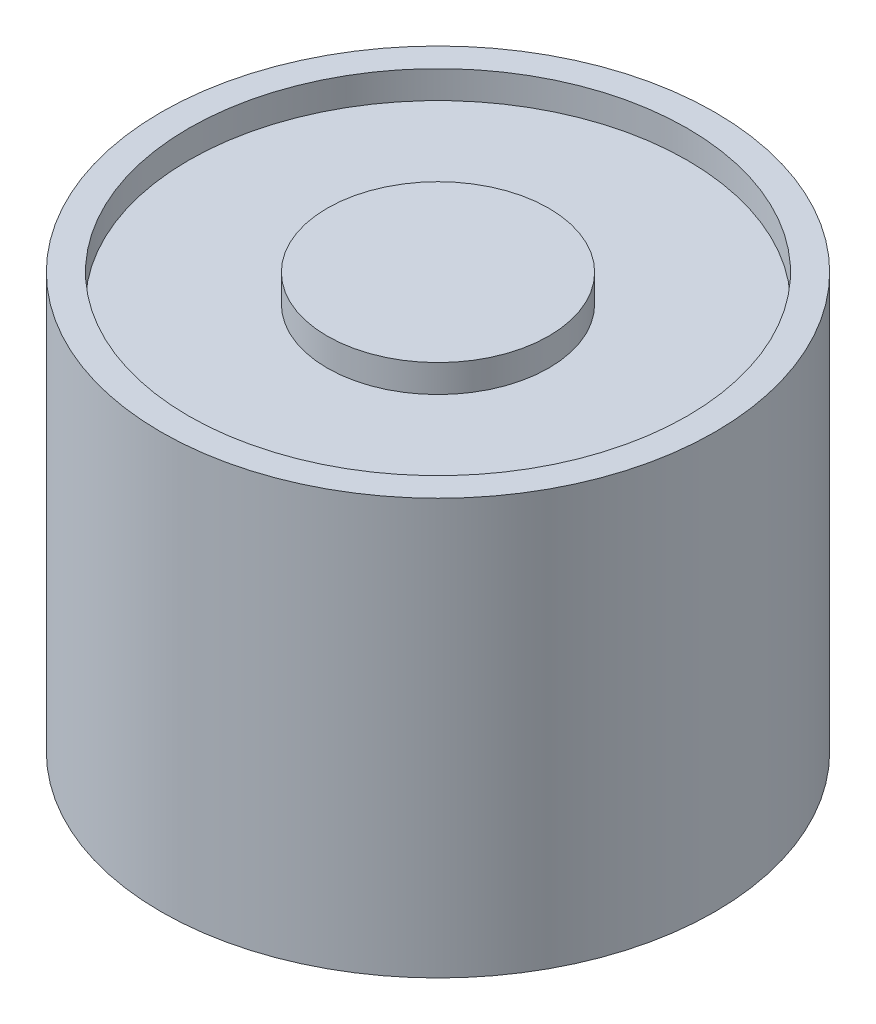
ISO-10303-21;
HEADER;
FILE_DESCRIPTION(('STEP AP214'),'2;1');
FILE_NAME('part.step','',(''),(''),'','','');
FILE_SCHEMA(('AUTOMOTIVE_DESIGN { 1 0 10303 214 1 1 1 1 }'));
ENDSEC;
DATA;
#1=APPLICATION_CONTEXT('core data for automotive mechanical design processes');
#2=APPLICATION_PROTOCOL_DEFINITION('international standard','automotive_design',2000,#1);
#3=PRODUCT_CONTEXT('',#1,'mechanical');
#4=PRODUCT('Part','Part','',(#3));
#5=PRODUCT_RELATED_PRODUCT_CATEGORY('part','',(#4));
#6=PRODUCT_DEFINITION_FORMATION('','',#4);
#7=PRODUCT_DEFINITION_CONTEXT('part definition',#1,'design');
#8=PRODUCT_DEFINITION('design','',#6,#7);
#9=PRODUCT_DEFINITION_SHAPE('','',#8);
#10=(LENGTH_UNIT() NAMED_UNIT(*) SI_UNIT(.MILLI.,.METRE.));
#11=(NAMED_UNIT(*) PLANE_ANGLE_UNIT() SI_UNIT($,.RADIAN.));
#12=(NAMED_UNIT(*) SI_UNIT($,.STERADIAN.) SOLID_ANGLE_UNIT());
#13=UNCERTAINTY_MEASURE_WITH_UNIT(LENGTH_MEASURE(1.E-05),#10,'distance_accuracy_value','');
#14=(GEOMETRIC_REPRESENTATION_CONTEXT(3) GLOBAL_UNCERTAINTY_ASSIGNED_CONTEXT((#13)) GLOBAL_UNIT_ASSIGNED_CONTEXT((#10,
#11,#12)) REPRESENTATION_CONTEXT('',''));
#15=CARTESIAN_POINT('',(0.,0.,0.));
#16=DIRECTION('',(0.,0.,1.));
#17=DIRECTION('',(1.,0.,0.));
#18=AXIS2_PLACEMENT_3D('',#15,#16,#17);
#19=CARTESIAN_POINT('',(0.,15.,0.));
#20=DIRECTION('',(0.,-1.,0.));
#21=DIRECTION('',(0.,0.,-1.));
#22=AXIS2_PLACEMENT_3D('',#19,#20,#21);
#23=CYLINDRICAL_SURFACE('',#22,10.);
#24=CARTESIAN_POINT('',(0.,15.,0.));
#25=DIRECTION('',(0.,1.,0.));
#26=DIRECTION('',(0.,0.,1.));
#27=AXIS2_PLACEMENT_3D('',#24,#25,#26);
#28=CIRCLE('',#27,10.);
#29=CARTESIAN_POINT('',(0.,15.,10.));
#30=VERTEX_POINT('',#29);
#31=EDGE_CURVE('E10',#30,#30,#28,.T.);
#32=ORIENTED_EDGE('',*,*,#31,.F.);
#33=EDGE_LOOP('',(#32));
#34=FACE_BOUND('',#33,.T.);
#35=CARTESIAN_POINT('',(0.,0.,0.));
#36=DIRECTION('',(0.,1.,0.));
#37=DIRECTION('',(0.,0.,1.));
#38=AXIS2_PLACEMENT_3D('',#35,#36,#37);
#39=CIRCLE('',#38,10.);
#40=CARTESIAN_POINT('',(0.,0.,10.));
#41=VERTEX_POINT('',#40);
#42=EDGE_CURVE('E46',#41,#41,#39,.T.);
#43=ORIENTED_EDGE('',*,*,#42,.T.);
#44=EDGE_LOOP('',(#43));
#45=FACE_BOUND('',#44,.T.);
#46=ADVANCED_FACE('F43',(#34,#45),#23,.T.);
#47=CARTESIAN_POINT('',(0.,15.,0.));
#48=DIRECTION('',(0.,1.,0.));
#49=DIRECTION('',(0.,0.,1.));
#50=AXIS2_PLACEMENT_3D('',#47,#48,#49);
#51=PLANE('',#50);
#52=CARTESIAN_POINT('',(0.,15.,0.));
#53=DIRECTION('',(0.,1.,0.));
#54=DIRECTION('',(0.,0.,1.));
#55=AXIS2_PLACEMENT_3D('',#52,#53,#54);
#56=CIRCLE('',#55,9.);
#57=CARTESIAN_POINT('',(0.,15.,9.));
#58=VERTEX_POINT('',#57);
#59=EDGE_CURVE('E57',#58,#58,#56,.T.);
#60=ORIENTED_EDGE('',*,*,#59,.F.);
#61=EDGE_LOOP('',(#60));
#62=FACE_BOUND('',#61,.T.);
#63=ORIENTED_EDGE('',*,*,#31,.T.);
#64=EDGE_LOOP('',(#63));
#65=FACE_BOUND('',#64,.T.);
#66=ADVANCED_FACE('F94',(#62,#65),#51,.T.);
#67=CARTESIAN_POINT('',(0.,0.,0.));
#68=DIRECTION('',(0.,1.,0.));
#69=DIRECTION('',(0.,0.,1.));
#70=AXIS2_PLACEMENT_3D('',#67,#68,#69);
#71=PLANE('',#70);
#72=CARTESIAN_POINT('',(0.,0.,0.));
#73=DIRECTION('',(0.,-1.,0.));
#74=DIRECTION('',(0.,0.,-1.));
#75=AXIS2_PLACEMENT_3D('',#72,#73,#74);
#76=CIRCLE('',#75,1.7);
#77=CARTESIAN_POINT('',(0.,0.,-1.7));
#78=VERTEX_POINT('',#77);
#79=EDGE_CURVE('E73',#78,#78,#76,.T.);
#80=ORIENTED_EDGE('',*,*,#79,.F.);
#81=EDGE_LOOP('',(#80));
#82=FACE_BOUND('',#81,.T.);
#83=ORIENTED_EDGE('',*,*,#42,.F.);
#84=EDGE_LOOP('',(#83));
#85=FACE_BOUND('',#84,.T.);
#86=ADVANCED_FACE('F90',(#82,#85),#71,.F.);
#87=CARTESIAN_POINT('',(0.,14.,0.));
#88=DIRECTION('',(0.,1.,0.));
#89=DIRECTION('',(0.,0.,1.));
#90=AXIS2_PLACEMENT_3D('',#87,#88,#89);
#91=CYLINDRICAL_SURFACE('',#90,9.);
#92=CARTESIAN_POINT('',(0.,14.,0.));
#93=DIRECTION('',(0.,1.,0.));
#94=DIRECTION('',(0.,0.,1.));
#95=AXIS2_PLACEMENT_3D('',#92,#93,#94);
#96=CIRCLE('',#95,9.);
#97=CARTESIAN_POINT('',(0.,14.,9.));
#98=VERTEX_POINT('',#97);
#99=EDGE_CURVE('E55',#98,#98,#96,.T.);
#100=ORIENTED_EDGE('',*,*,#99,.F.);
#101=EDGE_LOOP('',(#100));
#102=FACE_BOUND('',#101,.T.);
#103=ORIENTED_EDGE('',*,*,#59,.T.);
#104=EDGE_LOOP('',(#103));
#105=FACE_BOUND('',#104,.T.);
#106=ADVANCED_FACE('F93',(#102,#105),#91,.F.);
#107=CARTESIAN_POINT('',(0.,14.,0.));
#108=DIRECTION('',(0.,1.,0.));
#109=DIRECTION('',(0.,0.,1.));
#110=AXIS2_PLACEMENT_3D('',#107,#108,#109);
#111=PLANE('',#110);
#112=CARTESIAN_POINT('',(0.,14.,0.));
#113=DIRECTION('',(0.,1.,0.));
#114=DIRECTION('',(0.,0.,1.));
#115=AXIS2_PLACEMENT_3D('',#112,#113,#114);
#116=CIRCLE('',#115,4.);
#117=CARTESIAN_POINT('',(0.,14.,4.));
#118=VERTEX_POINT('',#117);
#119=EDGE_CURVE('E61',#118,#118,#116,.T.);
#120=ORIENTED_EDGE('',*,*,#119,.F.);
#121=EDGE_LOOP('',(#120));
#122=FACE_BOUND('',#121,.T.);
#123=ORIENTED_EDGE('',*,*,#99,.T.);
#124=EDGE_LOOP('',(#123));
#125=FACE_BOUND('',#124,.T.);
#126=ADVANCED_FACE('F114',(#122,#125),#111,.T.);
#127=CARTESIAN_POINT('',(0.,14.,0.));
#128=DIRECTION('',(0.,1.,0.));
#129=DIRECTION('',(0.,0.,1.));
#130=AXIS2_PLACEMENT_3D('',#127,#128,#129);
#131=CYLINDRICAL_SURFACE('',#130,4.);
#132=ORIENTED_EDGE('',*,*,#119,.T.);
#133=EDGE_LOOP('',(#132));
#134=FACE_BOUND('',#133,.T.);
#135=CARTESIAN_POINT('',(0.,15.,0.));
#136=DIRECTION('',(0.,1.,0.));
#137=DIRECTION('',(0.,0.,1.));
#138=AXIS2_PLACEMENT_3D('',#135,#136,#137);
#139=CIRCLE('',#138,4.);
#140=CARTESIAN_POINT('',(0.,15.,4.));
#141=VERTEX_POINT('',#140);
#142=EDGE_CURVE('E65',#141,#141,#139,.T.);
#143=ORIENTED_EDGE('',*,*,#142,.F.);
#144=EDGE_LOOP('',(#143));
#145=FACE_BOUND('',#144,.T.);
#146=ADVANCED_FACE('F109',(#134,#145),#131,.T.);
#147=ORIENTED_EDGE('',*,*,#142,.T.);
#148=EDGE_LOOP('',(#147));
#149=FACE_BOUND('',#148,.T.);
#150=ADVANCED_FACE('F86',(#149),#51,.T.);
#151=CARTESIAN_POINT('',(0.,4.,0.));
#152=DIRECTION('',(0.,-1.,0.));
#153=DIRECTION('',(0.,0.,-1.));
#154=AXIS2_PLACEMENT_3D('',#151,#152,#153);
#155=CYLINDRICAL_SURFACE('',#154,1.7);
#156=CARTESIAN_POINT('',(0.,4.,0.));
#157=DIRECTION('',(0.,-1.,0.));
#158=DIRECTION('',(0.,0.,-1.));
#159=AXIS2_PLACEMENT_3D('',#156,#157,#158);
#160=CIRCLE('',#159,1.7);
#161=CARTESIAN_POINT('',(0.,4.,-1.7));
#162=VERTEX_POINT('',#161);
#163=EDGE_CURVE('E69',#162,#162,#160,.T.);
#164=ORIENTED_EDGE('',*,*,#163,.F.);
#165=EDGE_LOOP('',(#164));
#166=FACE_BOUND('',#165,.T.);
#167=ORIENTED_EDGE('',*,*,#79,.T.);
#168=EDGE_LOOP('',(#167));
#169=FACE_BOUND('',#168,.T.);
#170=ADVANCED_FACE('F83',(#166,#169),#155,.F.);
#171=CARTESIAN_POINT('',(0.,4.,0.));
#172=DIRECTION('',(0.,-1.,0.));
#173=DIRECTION('',(0.,0.,-1.));
#174=AXIS2_PLACEMENT_3D('',#171,#172,#173);
#175=PLANE('',#174);
#176=ORIENTED_EDGE('',*,*,#163,.T.);
#177=EDGE_LOOP('',(#176));
#178=FACE_BOUND('',#177,.T.);
#179=ADVANCED_FACE('F81',(#178),#175,.T.);
#180=CLOSED_SHELL('',(#46,#66,#86,#106,#126,#146,#150,#170,#179));
#181=MANIFOLD_SOLID_BREP('B2',#180);
#182=ADVANCED_BREP_SHAPE_REPRESENTATION('',(#18,#181),#14);
#183=SHAPE_DEFINITION_REPRESENTATION(#9,#182);
ENDSEC;
END-ISO-10303-21;
